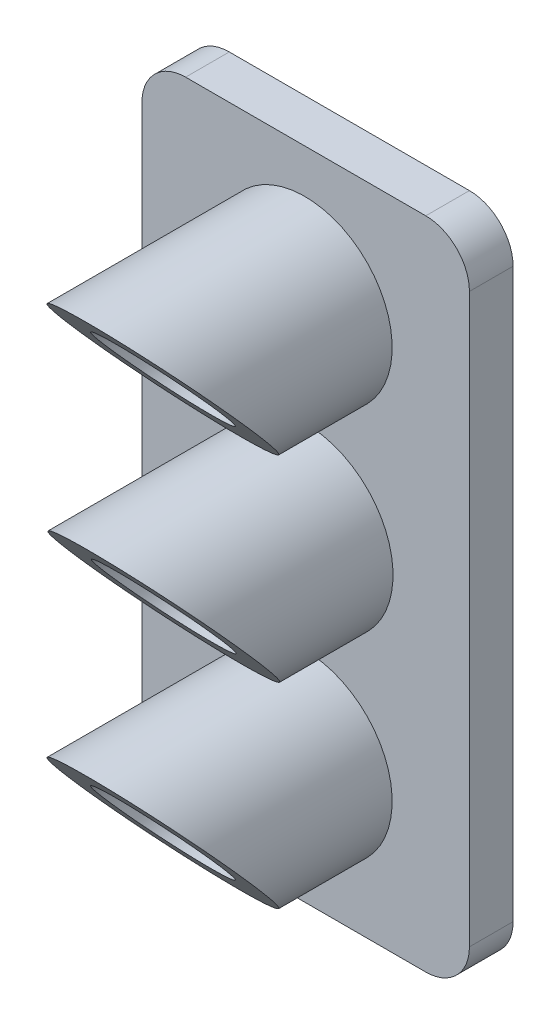
ISO-10303-21;
HEADER;
FILE_DESCRIPTION(('STEP AP214'),'2;1');
FILE_NAME('part.step','',(''),(''),'','','');
FILE_SCHEMA(('AUTOMOTIVE_DESIGN { 1 0 10303 214 1 1 1 1 }'));
ENDSEC;
DATA;
#1=APPLICATION_CONTEXT('core data for automotive mechanical design processes');
#2=APPLICATION_PROTOCOL_DEFINITION('international standard','automotive_design',2000,#1);
#3=PRODUCT_CONTEXT('',#1,'mechanical');
#4=PRODUCT('Part','Part','',(#3));
#5=PRODUCT_RELATED_PRODUCT_CATEGORY('part','',(#4));
#6=PRODUCT_DEFINITION_FORMATION('','',#4);
#7=PRODUCT_DEFINITION_CONTEXT('part definition',#1,'design');
#8=PRODUCT_DEFINITION('design','',#6,#7);
#9=PRODUCT_DEFINITION_SHAPE('','',#8);
#10=(LENGTH_UNIT() NAMED_UNIT(*) SI_UNIT(.MILLI.,.METRE.));
#11=(NAMED_UNIT(*) PLANE_ANGLE_UNIT() SI_UNIT($,.RADIAN.));
#12=(NAMED_UNIT(*) SI_UNIT($,.STERADIAN.) SOLID_ANGLE_UNIT());
#13=UNCERTAINTY_MEASURE_WITH_UNIT(LENGTH_MEASURE(1.E-05),#10,'distance_accuracy_value','');
#14=(GEOMETRIC_REPRESENTATION_CONTEXT(3) GLOBAL_UNCERTAINTY_ASSIGNED_CONTEXT((#13)) GLOBAL_UNIT_ASSIGNED_CONTEXT((#10,
#11,#12)) REPRESENTATION_CONTEXT('',''));
#15=CARTESIAN_POINT('',(0.,0.,0.));
#16=DIRECTION('',(0.,0.,1.));
#17=DIRECTION('',(1.,0.,0.));
#18=AXIS2_PLACEMENT_3D('',#15,#16,#17);
#19=CARTESIAN_POINT('',(7.5,-15.,0.));
#20=DIRECTION('',(0.,0.,-1.));
#21=DIRECTION('',(-1.,0.,0.));
#22=AXIS2_PLACEMENT_3D('',#19,#20,#21);
#23=PLANE('',#22);
#24=DIRECTION('',(0.,1.,0.));
#25=VECTOR('',#24,1.);
#26=CARTESIAN_POINT('',(-7.5,15.,0.));
#27=LINE('',#26,#25);
#28=CARTESIAN_POINT('',(-7.5,-13.,0.));
#29=VERTEX_POINT('',#28);
#30=CARTESIAN_POINT('',(-7.5,13.,0.));
#31=VERTEX_POINT('',#30);
#32=EDGE_CURVE('E226',#29,#31,#27,.T.);
#33=ORIENTED_EDGE('',*,*,#32,.F.);
#34=CARTESIAN_POINT('',(-5.5,-13.,0.));
#35=DIRECTION('',(0.,0.,-1.));
#36=DIRECTION('',(-1.,0.,0.));
#37=AXIS2_PLACEMENT_3D('',#34,#35,#36);
#38=CIRCLE('',#37,2.);
#39=CARTESIAN_POINT('',(-5.5,-15.,0.));
#40=VERTEX_POINT('',#39);
#41=EDGE_CURVE('E322',#29,#40,#38,.F.);
#42=ORIENTED_EDGE('',*,*,#41,.T.);
#43=DIRECTION('',(-1.,0.,0.));
#44=VECTOR('',#43,1.);
#45=CARTESIAN_POINT('',(7.5,-15.,0.));
#46=LINE('',#45,#44);
#47=CARTESIAN_POINT('',(5.5,-15.,0.));
#48=VERTEX_POINT('',#47);
#49=EDGE_CURVE('E223',#48,#40,#46,.T.);
#50=ORIENTED_EDGE('',*,*,#49,.F.);
#51=CARTESIAN_POINT('',(5.5,-13.,0.));
#52=DIRECTION('',(0.,0.,-1.));
#53=DIRECTION('',(-1.,0.,0.));
#54=AXIS2_PLACEMENT_3D('',#51,#52,#53);
#55=CIRCLE('',#54,2.);
#56=CARTESIAN_POINT('',(7.5,-13.,0.));
#57=VERTEX_POINT('',#56);
#58=EDGE_CURVE('E320',#48,#57,#55,.F.);
#59=ORIENTED_EDGE('',*,*,#58,.T.);
#60=DIRECTION('',(0.,-1.,0.));
#61=VECTOR('',#60,1.);
#62=CARTESIAN_POINT('',(7.5,15.,0.));
#63=LINE('',#62,#61);
#64=CARTESIAN_POINT('',(7.5,13.,0.));
#65=VERTEX_POINT('',#64);
#66=EDGE_CURVE('E202',#65,#57,#63,.T.);
#67=ORIENTED_EDGE('',*,*,#66,.F.);
#68=CARTESIAN_POINT('',(5.5,13.,0.));
#69=DIRECTION('',(0.,0.,-1.));
#70=DIRECTION('',(-1.,0.,0.));
#71=AXIS2_PLACEMENT_3D('',#68,#69,#70);
#72=CIRCLE('',#71,2.);
#73=CARTESIAN_POINT('',(5.5,15.,0.));
#74=VERTEX_POINT('',#73);
#75=EDGE_CURVE('E317',#65,#74,#72,.F.);
#76=ORIENTED_EDGE('',*,*,#75,.T.);
#77=DIRECTION('',(1.,0.,0.));
#78=VECTOR('',#77,1.);
#79=CARTESIAN_POINT('',(7.5,15.,0.));
#80=LINE('',#79,#78);
#81=CARTESIAN_POINT('',(-5.5,15.,0.));
#82=VERTEX_POINT('',#81);
#83=EDGE_CURVE('E213',#82,#74,#80,.T.);
#84=ORIENTED_EDGE('',*,*,#83,.F.);
#85=CARTESIAN_POINT('',(-5.5,13.,0.));
#86=DIRECTION('',(0.,0.,-1.));
#87=DIRECTION('',(-1.,0.,0.));
#88=AXIS2_PLACEMENT_3D('',#85,#86,#87);
#89=CIRCLE('',#88,2.);
#90=EDGE_CURVE('E315',#82,#31,#89,.F.);
#91=ORIENTED_EDGE('',*,*,#90,.T.);
#92=EDGE_LOOP('',(#33,#42,#50,#59,#67,#76,#84,#91));
#93=FACE_BOUND('',#92,.T.);
#94=CARTESIAN_POINT('',(-0.0396904354345345,8.99991248120419,0.));
#95=DIRECTION('',(0.,0.,-1.));
#96=DIRECTION('',(-1.,0.,0.));
#97=AXIS2_PLACEMENT_3D('',#94,#95,#96);
#98=CIRCLE('',#97,4.);
#99=CARTESIAN_POINT('',(-4.03969043543453,8.99991248120419,0.));
#100=VERTEX_POINT('',#99);
#101=EDGE_CURVE('E220',#100,#100,#98,.T.);
#102=ORIENTED_EDGE('',*,*,#101,.T.);
#103=EDGE_LOOP('',(#102));
#104=FACE_BOUND('',#103,.T.);
#105=CARTESIAN_POINT('',(0.,0.,0.));
#106=DIRECTION('',(0.,0.,-1.));
#107=DIRECTION('',(-1.,0.,0.));
#108=AXIS2_PLACEMENT_3D('',#105,#106,#107);
#109=CIRCLE('',#108,4.);
#110=CARTESIAN_POINT('',(-4.,0.,0.));
#111=VERTEX_POINT('',#110);
#112=EDGE_CURVE('E232',#111,#111,#109,.F.);
#113=ORIENTED_EDGE('',*,*,#112,.F.);
#114=EDGE_LOOP('',(#113));
#115=FACE_BOUND('',#114,.T.);
#116=CARTESIAN_POINT('',(-0.0396209306054457,-8.99991278745844,0.));
#117=DIRECTION('',(0.,0.,-1.));
#118=DIRECTION('',(-1.,0.,0.));
#119=AXIS2_PLACEMENT_3D('',#116,#117,#118);
#120=CIRCLE('',#119,4.);
#121=CARTESIAN_POINT('',(-4.03962093060545,-8.99991278745844,0.));
#122=VERTEX_POINT('',#121);
#123=EDGE_CURVE('E235',#122,#122,#120,.F.);
#124=ORIENTED_EDGE('',*,*,#123,.F.);
#125=EDGE_LOOP('',(#124));
#126=FACE_BOUND('',#125,.T.);
#127=ADVANCED_FACE('F30',(#93,#104,#115,#126),#23,.F.);
#128=CARTESIAN_POINT('',(-0.0396904354345345,8.99991248120419,10.));
#129=DIRECTION('',(0.,0.,-1.));
#130=DIRECTION('',(-1.,0.,0.));
#131=AXIS2_PLACEMENT_3D('',#128,#129,#130);
#132=CYLINDRICAL_SURFACE('',#131,4.);
#133=CARTESIAN_POINT('',(-0.0396904354345345,8.99991248120419,3.));
#134=DIRECTION('',(0.,0.,-1.));
#135=DIRECTION('',(0.00934685832223029,-0.999956317165657,0.));
#136=AXIS2_PLACEMENT_3D('',#133,#134,#135);
#137=CIRCLE('',#136,4.);
#138=CARTESIAN_POINT('',(-0.00230300214561532,5.00008721254156,3.));
#139=VERTEX_POINT('',#138);
#140=CARTESIAN_POINT('',(-0.0770778687234547,5.00008721254156,3.));
#141=VERTEX_POINT('',#140);
#142=EDGE_CURVE('E119',#139,#141,#137,.T.);
#143=ORIENTED_EDGE('',*,*,#142,.T.);
#144=CARTESIAN_POINT('',(-0.0396904354345345,8.99991248120419,6.4998471100798));
#145=DIRECTION('',(0.,0.658504607868518,-0.752576694706878));
#146=DIRECTION('',(0.,-0.752576694706878,-0.658504607868518));
#147=AXIS2_PLACEMENT_3D('',#144,#145,#146);
#148=ELLIPSE('',#147,5.31507290636732,4.);
#149=EDGE_CURVE('E205',#141,#139,#148,.T.);
#150=ORIENTED_EDGE('',*,*,#149,.T.);
#151=EDGE_LOOP('',(#143,#150));
#152=FACE_BOUND('',#151,.T.);
#153=ORIENTED_EDGE('',*,*,#101,.F.);
#154=EDGE_LOOP('',(#153));
#155=FACE_BOUND('',#154,.T.);
#156=ADVANCED_FACE('F147',(#152,#155),#132,.T.);
#157=CARTESIAN_POINT('',(-0.0396904354345345,8.99991248120419,10.));
#158=DIRECTION('',(0.,0.,-1.));
#159=DIRECTION('',(-1.,0.,0.));
#160=AXIS2_PLACEMENT_3D('',#157,#158,#159);
#161=CYLINDRICAL_SURFACE('',#160,2.5);
#162=CARTESIAN_POINT('',(-0.0396904354345345,8.99991248120419,6.4998471100798));
#163=DIRECTION('',(0.,0.658504607868518,-0.752576694706878));
#164=DIRECTION('',(0.,-0.752576694706878,-0.658504607868518));
#165=AXIS2_PLACEMENT_3D('',#162,#163,#164);
#166=ELLIPSE('',#165,3.32192056647958,2.5);
#167=CARTESIAN_POINT('',(-0.0396904354345348,6.49991248120419,4.3123471100798));
#168=VERTEX_POINT('',#167);
#169=EDGE_CURVE('E238',#168,#168,#166,.T.);
#170=ORIENTED_EDGE('',*,*,#169,.F.);
#171=EDGE_LOOP('',(#170));
#172=FACE_BOUND('',#171,.T.);
#173=CARTESIAN_POINT('',(-0.0396904354345345,8.99991248120419,-2.));
#174=DIRECTION('',(0.,0.,1.));
#175=DIRECTION('',(1.,0.,0.));
#176=AXIS2_PLACEMENT_3D('',#173,#174,#175);
#177=CIRCLE('',#176,2.5);
#178=CARTESIAN_POINT('',(2.46030956456547,8.99991248120419,-2.));
#179=VERTEX_POINT('',#178);
#180=EDGE_CURVE('E198',#179,#179,#177,.T.);
#181=ORIENTED_EDGE('',*,*,#180,.F.);
#182=EDGE_LOOP('',(#181));
#183=FACE_BOUND('',#182,.T.);
#184=ADVANCED_FACE('F162',(#172,#183),#161,.F.);
#185=CARTESIAN_POINT('',(7.5,15.,-2.));
#186=DIRECTION('',(-1.,0.,0.));
#187=DIRECTION('',(0.,-1.,0.));
#188=AXIS2_PLACEMENT_3D('',#185,#186,#187);
#189=PLANE('',#188);
#190=ORIENTED_EDGE('',*,*,#66,.T.);
#191=DIRECTION('',(0.,0.,1.));
#192=VECTOR('',#191,1.);
#193=CARTESIAN_POINT('',(7.5,-13.,-2.));
#194=LINE('',#193,#192);
#195=CARTESIAN_POINT('',(7.5,-13.,-2.));
#196=VERTEX_POINT('',#195);
#197=EDGE_CURVE('E303',#57,#196,#194,.F.);
#198=ORIENTED_EDGE('',*,*,#197,.T.);
#199=DIRECTION('',(0.,-1.,0.));
#200=VECTOR('',#199,1.);
#201=CARTESIAN_POINT('',(7.5,15.,-2.));
#202=LINE('',#201,#200);
#203=CARTESIAN_POINT('',(7.5,13.,-2.));
#204=VERTEX_POINT('',#203);
#205=EDGE_CURVE('E209',#204,#196,#202,.T.);
#206=ORIENTED_EDGE('',*,*,#205,.F.);
#207=DIRECTION('',(0.,0.,1.));
#208=VECTOR('',#207,1.);
#209=CARTESIAN_POINT('',(7.5,13.,-2.));
#210=LINE('',#209,#208);
#211=EDGE_CURVE('E300',#204,#65,#210,.T.);
#212=ORIENTED_EDGE('',*,*,#211,.T.);
#213=EDGE_LOOP('',(#190,#198,#206,#212));
#214=FACE_BOUND('',#213,.T.);
#215=ADVANCED_FACE('F158',(#214),#189,.F.);
#216=CARTESIAN_POINT('',(7.5,-15.,-2.));
#217=DIRECTION('',(0.,1.,0.));
#218=DIRECTION('',(0.,0.,1.));
#219=AXIS2_PLACEMENT_3D('',#216,#217,#218);
#220=PLANE('',#219);
#221=ORIENTED_EDGE('',*,*,#49,.T.);
#222=DIRECTION('',(0.,0.,1.));
#223=VECTOR('',#222,1.);
#224=CARTESIAN_POINT('',(-5.5,-15.,-2.));
#225=LINE('',#224,#223);
#226=CARTESIAN_POINT('',(-5.5,-15.,-2.));
#227=VERTEX_POINT('',#226);
#228=EDGE_CURVE('E297',#40,#227,#225,.F.);
#229=ORIENTED_EDGE('',*,*,#228,.T.);
#230=DIRECTION('',(-1.,0.,0.));
#231=VECTOR('',#230,1.);
#232=CARTESIAN_POINT('',(7.5,-15.,-2.));
#233=LINE('',#232,#231);
#234=CARTESIAN_POINT('',(5.5,-15.,-2.));
#235=VERTEX_POINT('',#234);
#236=EDGE_CURVE('E212',#235,#227,#233,.T.);
#237=ORIENTED_EDGE('',*,*,#236,.F.);
#238=DIRECTION('',(0.,0.,1.));
#239=VECTOR('',#238,1.);
#240=CARTESIAN_POINT('',(5.5,-15.,-2.));
#241=LINE('',#240,#239);
#242=EDGE_CURVE('E327',#235,#48,#241,.T.);
#243=ORIENTED_EDGE('',*,*,#242,.T.);
#244=EDGE_LOOP('',(#221,#229,#237,#243));
#245=FACE_BOUND('',#244,.T.);
#246=ADVANCED_FACE('F154',(#245),#220,.F.);
#247=CARTESIAN_POINT('',(-7.5,15.,-2.));
#248=DIRECTION('',(1.,0.,0.));
#249=DIRECTION('',(0.,1.,0.));
#250=AXIS2_PLACEMENT_3D('',#247,#248,#249);
#251=PLANE('',#250);
#252=DIRECTION('',(0.,1.,0.));
#253=VECTOR('',#252,1.);
#254=CARTESIAN_POINT('',(-7.5,15.,-2.));
#255=LINE('',#254,#253);
#256=CARTESIAN_POINT('',(-7.5,-13.,-2.));
#257=VERTEX_POINT('',#256);
#258=CARTESIAN_POINT('',(-7.5,13.,-2.));
#259=VERTEX_POINT('',#258);
#260=EDGE_CURVE('E216',#257,#259,#255,.T.);
#261=ORIENTED_EDGE('',*,*,#260,.F.);
#262=DIRECTION('',(0.,0.,1.));
#263=VECTOR('',#262,1.);
#264=CARTESIAN_POINT('',(-7.5,-13.,-2.));
#265=LINE('',#264,#263);
#266=EDGE_CURVE('E299',#257,#29,#265,.T.);
#267=ORIENTED_EDGE('',*,*,#266,.T.);
#268=ORIENTED_EDGE('',*,*,#32,.T.);
#269=DIRECTION('',(0.,0.,1.));
#270=VECTOR('',#269,1.);
#271=CARTESIAN_POINT('',(-7.5,13.,-2.));
#272=LINE('',#271,#270);
#273=EDGE_CURVE('E118',#31,#259,#272,.F.);
#274=ORIENTED_EDGE('',*,*,#273,.T.);
#275=EDGE_LOOP('',(#261,#267,#268,#274));
#276=FACE_BOUND('',#275,.T.);
#277=ADVANCED_FACE('F151',(#276),#251,.F.);
#278=CARTESIAN_POINT('',(7.5,15.,-2.));
#279=DIRECTION('',(0.,-1.,0.));
#280=DIRECTION('',(0.,0.,-1.));
#281=AXIS2_PLACEMENT_3D('',#278,#279,#280);
#282=PLANE('',#281);
#283=ORIENTED_EDGE('',*,*,#83,.T.);
#284=DIRECTION('',(0.,0.,1.));
#285=VECTOR('',#284,1.);
#286=CARTESIAN_POINT('',(5.5,15.,-2.));
#287=LINE('',#286,#285);
#288=CARTESIAN_POINT('',(5.5,15.,-2.));
#289=VERTEX_POINT('',#288);
#290=EDGE_CURVE('E11',#74,#289,#287,.F.);
#291=ORIENTED_EDGE('',*,*,#290,.T.);
#292=DIRECTION('',(1.,0.,0.));
#293=VECTOR('',#292,1.);
#294=CARTESIAN_POINT('',(7.5,15.,-2.));
#295=LINE('',#294,#293);
#296=CARTESIAN_POINT('',(-5.5,15.,-2.));
#297=VERTEX_POINT('',#296);
#298=EDGE_CURVE('E218',#297,#289,#295,.T.);
#299=ORIENTED_EDGE('',*,*,#298,.F.);
#300=DIRECTION('',(0.,0.,1.));
#301=VECTOR('',#300,1.);
#302=CARTESIAN_POINT('',(-5.5,15.,-2.));
#303=LINE('',#302,#301);
#304=EDGE_CURVE('E38',#297,#82,#303,.T.);
#305=ORIENTED_EDGE('',*,*,#304,.T.);
#306=EDGE_LOOP('',(#283,#291,#299,#305));
#307=FACE_BOUND('',#306,.T.);
#308=ADVANCED_FACE('F143',(#307),#282,.F.);
#309=CARTESIAN_POINT('',(7.5,-15.,-2.));
#310=DIRECTION('',(0.,0.,-1.));
#311=DIRECTION('',(-1.,0.,0.));
#312=AXIS2_PLACEMENT_3D('',#309,#310,#311);
#313=PLANE('',#312);
#314=CARTESIAN_POINT('',(-0.0396209306054457,-8.99991278745844,-2.));
#315=DIRECTION('',(0.,0.,1.));
#316=DIRECTION('',(1.,0.,0.));
#317=AXIS2_PLACEMENT_3D('',#314,#315,#316);
#318=CIRCLE('',#317,2.5);
#319=CARTESIAN_POINT('',(2.46037906939456,-8.99991278745844,-2.));
#320=VERTEX_POINT('',#319);
#321=EDGE_CURVE('E199',#320,#320,#318,.T.);
#322=ORIENTED_EDGE('',*,*,#321,.T.);
#323=EDGE_LOOP('',(#322));
#324=FACE_BOUND('',#323,.T.);
#325=CARTESIAN_POINT('',(0.,0.,-2.));
#326=DIRECTION('',(0.,0.,1.));
#327=DIRECTION('',(1.,0.,0.));
#328=AXIS2_PLACEMENT_3D('',#325,#326,#327);
#329=CIRCLE('',#328,2.5);
#330=CARTESIAN_POINT('',(2.5,0.,-2.));
#331=VERTEX_POINT('',#330);
#332=EDGE_CURVE('E196',#331,#331,#329,.T.);
#333=ORIENTED_EDGE('',*,*,#332,.T.);
#334=EDGE_LOOP('',(#333));
#335=FACE_BOUND('',#334,.T.);
#336=ORIENTED_EDGE('',*,*,#180,.T.);
#337=EDGE_LOOP('',(#336));
#338=FACE_BOUND('',#337,.T.);
#339=ORIENTED_EDGE('',*,*,#236,.T.);
#340=CARTESIAN_POINT('',(-5.5,-13.,-2.));
#341=DIRECTION('',(0.,0.,-1.));
#342=DIRECTION('',(-1.,0.,0.));
#343=AXIS2_PLACEMENT_3D('',#340,#341,#342);
#344=CIRCLE('',#343,2.);
#345=EDGE_CURVE('E288',#227,#257,#344,.T.);
#346=ORIENTED_EDGE('',*,*,#345,.T.);
#347=ORIENTED_EDGE('',*,*,#260,.T.);
#348=CARTESIAN_POINT('',(-5.5,13.,-2.));
#349=DIRECTION('',(0.,0.,-1.));
#350=DIRECTION('',(-1.,0.,0.));
#351=AXIS2_PLACEMENT_3D('',#348,#349,#350);
#352=CIRCLE('',#351,2.);
#353=EDGE_CURVE('E50',#259,#297,#352,.T.);
#354=ORIENTED_EDGE('',*,*,#353,.T.);
#355=ORIENTED_EDGE('',*,*,#298,.T.);
#356=CARTESIAN_POINT('',(5.5,13.,-2.));
#357=DIRECTION('',(0.,0.,-1.));
#358=DIRECTION('',(-1.,0.,0.));
#359=AXIS2_PLACEMENT_3D('',#356,#357,#358);
#360=CIRCLE('',#359,2.);
#361=EDGE_CURVE('E305',#289,#204,#360,.T.);
#362=ORIENTED_EDGE('',*,*,#361,.T.);
#363=ORIENTED_EDGE('',*,*,#205,.T.);
#364=CARTESIAN_POINT('',(5.5,-13.,-2.));
#365=DIRECTION('',(0.,0.,-1.));
#366=DIRECTION('',(-1.,0.,0.));
#367=AXIS2_PLACEMENT_3D('',#364,#365,#366);
#368=CIRCLE('',#367,2.);
#369=EDGE_CURVE('E291',#196,#235,#368,.T.);
#370=ORIENTED_EDGE('',*,*,#369,.T.);
#371=EDGE_LOOP('',(#339,#346,#347,#354,#355,#362,#363,#370));
#372=FACE_BOUND('',#371,.T.);
#373=ADVANCED_FACE('F139',(#324,#335,#338,#372),#313,.T.);
#374=CARTESIAN_POINT('',(0.,0.,10.));
#375=DIRECTION('',(0.,0.,-1.));
#376=DIRECTION('',(-1.,0.,0.));
#377=AXIS2_PLACEMENT_3D('',#374,#375,#376);
#378=CYLINDRICAL_SURFACE('',#377,4.);
#379=CARTESIAN_POINT('',(0.,0.,6.49992368902613));
#380=DIRECTION('',(0.,0.658504607868518,-0.752576694706878));
#381=DIRECTION('',(0.,-0.752576694706878,-0.658504607868518));
#382=AXIS2_PLACEMENT_3D('',#379,#380,#381);
#383=ELLIPSE('',#382,5.31507290636732,4.);
#384=CARTESIAN_POINT('',(-0.0264138737497387,-3.99991278745844,3.));
#385=VERTEX_POINT('',#384);
#386=CARTESIAN_POINT('',(0.0264138737497456,-3.99991278745844,3.));
#387=VERTEX_POINT('',#386);
#388=EDGE_CURVE('E106',#385,#387,#383,.T.);
#389=ORIENTED_EDGE('',*,*,#388,.T.);
#390=CARTESIAN_POINT('',(0.,0.,3.));
#391=DIRECTION('',(0.,0.,-1.));
#392=DIRECTION('',(0.00660346843743643,-0.99997819686461,0.));
#393=AXIS2_PLACEMENT_3D('',#390,#391,#392);
#394=CIRCLE('',#393,4.);
#395=EDGE_CURVE('E109',#387,#385,#394,.T.);
#396=ORIENTED_EDGE('',*,*,#395,.T.);
#397=EDGE_LOOP('',(#389,#396));
#398=FACE_BOUND('',#397,.T.);
#399=ORIENTED_EDGE('',*,*,#112,.T.);
#400=EDGE_LOOP('',(#399));
#401=FACE_BOUND('',#400,.T.);
#402=ADVANCED_FACE('F116',(#398,#401),#378,.T.);
#403=CARTESIAN_POINT('',(0.,0.,10.));
#404=DIRECTION('',(0.,0.,-1.));
#405=DIRECTION('',(-1.,0.,0.));
#406=AXIS2_PLACEMENT_3D('',#403,#404,#405);
#407=CYLINDRICAL_SURFACE('',#406,2.5);
#408=CARTESIAN_POINT('',(0.,0.,6.49992368902613));
#409=DIRECTION('',(0.,0.658504607868518,-0.752576694706878));
#410=DIRECTION('',(0.,-0.752576694706878,-0.658504607868518));
#411=AXIS2_PLACEMENT_3D('',#408,#409,#410);
#412=ELLIPSE('',#411,3.32192056647958,2.5);
#413=CARTESIAN_POINT('',(0.,-2.5,4.31242368902613));
#414=VERTEX_POINT('',#413);
#415=EDGE_CURVE('E113',#414,#414,#412,.T.);
#416=ORIENTED_EDGE('',*,*,#415,.F.);
#417=EDGE_LOOP('',(#416));
#418=FACE_BOUND('',#417,.T.);
#419=ORIENTED_EDGE('',*,*,#332,.F.);
#420=EDGE_LOOP('',(#419));
#421=FACE_BOUND('',#420,.T.);
#422=ADVANCED_FACE('F138',(#418,#421),#407,.F.);
#423=CARTESIAN_POINT('',(-0.0396209306054457,-8.99991278745844,10.));
#424=DIRECTION('',(0.,0.,-1.));
#425=DIRECTION('',(-1.,0.,0.));
#426=AXIS2_PLACEMENT_3D('',#423,#424,#425);
#427=CYLINDRICAL_SURFACE('',#426,4.);
#428=CARTESIAN_POINT('',(-0.0396209306054457,-8.99991278745844,6.5));
#429=DIRECTION('',(0.,0.658504607868518,-0.752576694706878));
#430=DIRECTION('',(0.,-0.752576694706878,-0.658504607868518));
#431=AXIS2_PLACEMENT_3D('',#428,#429,#430);
#432=ELLIPSE('',#431,5.31507290636732,4.);
#433=CARTESIAN_POINT('',(-0.0396209306054461,-12.9999127874584,3.));
#434=VERTEX_POINT('',#433);
#435=EDGE_CURVE('E186',#434,#434,#432,.T.);
#436=ORIENTED_EDGE('',*,*,#435,.T.);
#437=EDGE_LOOP('',(#436));
#438=FACE_BOUND('',#437,.T.);
#439=ORIENTED_EDGE('',*,*,#123,.T.);
#440=EDGE_LOOP('',(#439));
#441=FACE_BOUND('',#440,.T.);
#442=ADVANCED_FACE('F193',(#438,#441),#427,.T.);
#443=CARTESIAN_POINT('',(-0.0396209306054457,-8.99991278745844,10.));
#444=DIRECTION('',(0.,0.,-1.));
#445=DIRECTION('',(-1.,0.,0.));
#446=AXIS2_PLACEMENT_3D('',#443,#444,#445);
#447=CYLINDRICAL_SURFACE('',#446,2.5);
#448=CARTESIAN_POINT('',(-0.0396209306054457,-8.99991278745844,6.5));
#449=DIRECTION('',(0.,0.658504607868518,-0.752576694706878));
#450=DIRECTION('',(0.,-0.752576694706878,-0.658504607868518));
#451=AXIS2_PLACEMENT_3D('',#448,#449,#450);
#452=ELLIPSE('',#451,3.32192056647958,2.5);
#453=CARTESIAN_POINT('',(-0.039620930605446,-11.4999127874584,4.3125));
#454=VERTEX_POINT('',#453);
#455=EDGE_CURVE('E112',#454,#454,#452,.T.);
#456=ORIENTED_EDGE('',*,*,#455,.F.);
#457=EDGE_LOOP('',(#456));
#458=FACE_BOUND('',#457,.T.);
#459=ORIENTED_EDGE('',*,*,#321,.F.);
#460=EDGE_LOOP('',(#459));
#461=FACE_BOUND('',#460,.T.);
#462=ADVANCED_FACE('F261',(#458,#461),#447,.F.);
#463=CARTESIAN_POINT('',(14.5,5.00008721254156,3.));
#464=DIRECTION('',(0.,0.658504607868518,-0.752576694706878));
#465=DIRECTION('',(0.,0.752576694706878,0.658504607868518));
#466=AXIS2_PLACEMENT_3D('',#463,#464,#465);
#467=PLANE('',#466);
#468=ORIENTED_EDGE('',*,*,#169,.T.);
#469=EDGE_LOOP('',(#468));
#470=FACE_BOUND('',#469,.T.);
#471=ORIENTED_EDGE('',*,*,#142,.F.);
#472=ORIENTED_EDGE('',*,*,#149,.F.);
#473=EDGE_LOOP('',(#471,#472));
#474=FACE_BOUND('',#473,.T.);
#475=ADVANCED_FACE('F250',(#470,#474),#467,.F.);
#476=CARTESIAN_POINT('',(14.5,-12.9999127874584,3.));
#477=DIRECTION('',(0.,0.658504607868518,-0.752576694706878));
#478=DIRECTION('',(0.,0.752576694706878,0.658504607868518));
#479=AXIS2_PLACEMENT_3D('',#476,#477,#478);
#480=PLANE('',#479);
#481=ORIENTED_EDGE('',*,*,#455,.T.);
#482=EDGE_LOOP('',(#481));
#483=FACE_BOUND('',#482,.T.);
#484=ORIENTED_EDGE('',*,*,#435,.F.);
#485=EDGE_LOOP('',(#484));
#486=FACE_BOUND('',#485,.T.);
#487=ADVANCED_FACE('F260',(#483,#486),#480,.F.);
#488=CARTESIAN_POINT('',(14.5,-3.99991278745844,3.));
#489=DIRECTION('',(0.,0.658504607868518,-0.752576694706878));
#490=DIRECTION('',(0.,0.752576694706878,0.658504607868518));
#491=AXIS2_PLACEMENT_3D('',#488,#489,#490);
#492=PLANE('',#491);
#493=ORIENTED_EDGE('',*,*,#415,.T.);
#494=EDGE_LOOP('',(#493));
#495=FACE_BOUND('',#494,.T.);
#496=ORIENTED_EDGE('',*,*,#395,.F.);
#497=ORIENTED_EDGE('',*,*,#388,.F.);
#498=EDGE_LOOP('',(#496,#497));
#499=FACE_BOUND('',#498,.T.);
#500=ADVANCED_FACE('F108',(#495,#499),#492,.F.);
#501=CARTESIAN_POINT('',(-5.5,-13.,-2.));
#502=DIRECTION('',(0.,0.,1.));
#503=DIRECTION('',(1.,0.,0.));
#504=AXIS2_PLACEMENT_3D('',#501,#502,#503);
#505=CYLINDRICAL_SURFACE('',#504,2.);
#506=ORIENTED_EDGE('',*,*,#345,.F.);
#507=ORIENTED_EDGE('',*,*,#228,.F.);
#508=ORIENTED_EDGE('',*,*,#41,.F.);
#509=ORIENTED_EDGE('',*,*,#266,.F.);
#510=EDGE_LOOP('',(#506,#507,#508,#509));
#511=FACE_BOUND('',#510,.T.);
#512=ADVANCED_FACE('F171',(#511),#505,.T.);
#513=CARTESIAN_POINT('',(5.5,-13.,-2.));
#514=DIRECTION('',(0.,0.,1.));
#515=DIRECTION('',(1.,0.,0.));
#516=AXIS2_PLACEMENT_3D('',#513,#514,#515);
#517=CYLINDRICAL_SURFACE('',#516,2.);
#518=ORIENTED_EDGE('',*,*,#369,.F.);
#519=ORIENTED_EDGE('',*,*,#197,.F.);
#520=ORIENTED_EDGE('',*,*,#58,.F.);
#521=ORIENTED_EDGE('',*,*,#242,.F.);
#522=EDGE_LOOP('',(#518,#519,#520,#521));
#523=FACE_BOUND('',#522,.T.);
#524=ADVANCED_FACE('F335',(#523),#517,.T.);
#525=CARTESIAN_POINT('',(5.5,13.,-2.));
#526=DIRECTION('',(0.,0.,1.));
#527=DIRECTION('',(1.,0.,0.));
#528=AXIS2_PLACEMENT_3D('',#525,#526,#527);
#529=CYLINDRICAL_SURFACE('',#528,2.);
#530=ORIENTED_EDGE('',*,*,#361,.F.);
#531=ORIENTED_EDGE('',*,*,#290,.F.);
#532=ORIENTED_EDGE('',*,*,#75,.F.);
#533=ORIENTED_EDGE('',*,*,#211,.F.);
#534=EDGE_LOOP('',(#530,#531,#532,#533));
#535=FACE_BOUND('',#534,.T.);
#536=ADVANCED_FACE('F333',(#535),#529,.T.);
#537=CARTESIAN_POINT('',(-5.5,13.,-2.));
#538=DIRECTION('',(0.,0.,1.));
#539=DIRECTION('',(1.,0.,0.));
#540=AXIS2_PLACEMENT_3D('',#537,#538,#539);
#541=CYLINDRICAL_SURFACE('',#540,2.);
#542=ORIENTED_EDGE('',*,*,#353,.F.);
#543=ORIENTED_EDGE('',*,*,#273,.F.);
#544=ORIENTED_EDGE('',*,*,#90,.F.);
#545=ORIENTED_EDGE('',*,*,#304,.F.);
#546=EDGE_LOOP('',(#542,#543,#544,#545));
#547=FACE_BOUND('',#546,.T.);
#548=ADVANCED_FACE('F32',(#547),#541,.T.);
#549=CLOSED_SHELL('',(#127,#156,#184,#215,#246,#277,#308,#373,#402,#422,#442,#462,#475,#487,
#500,#512,#524,#536,#548));
#550=MANIFOLD_SOLID_BREP('B2',#549);
#551=ADVANCED_BREP_SHAPE_REPRESENTATION('',(#18,#550),#14);
#552=SHAPE_DEFINITION_REPRESENTATION(#9,#551);
ENDSEC;
END-ISO-10303-21;
